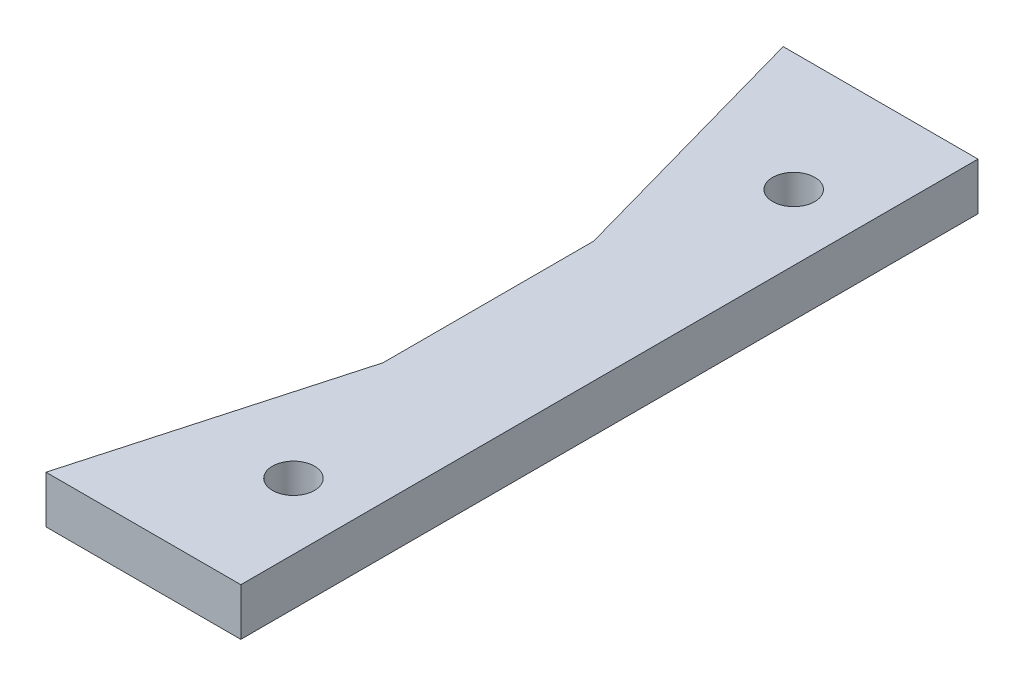
ISO-10303-21;
HEADER;
FILE_DESCRIPTION(('STEP AP214'),'2;1');
FILE_NAME('part.step','',(''),(''),'','','');
FILE_SCHEMA(('AUTOMOTIVE_DESIGN { 1 0 10303 214 1 1 1 1 }'));
ENDSEC;
DATA;
#1=APPLICATION_CONTEXT('core data for automotive mechanical design processes');
#2=APPLICATION_PROTOCOL_DEFINITION('international standard','automotive_design',2000,#1);
#3=PRODUCT_CONTEXT('',#1,'mechanical');
#4=PRODUCT('Part','Part','',(#3));
#5=PRODUCT_RELATED_PRODUCT_CATEGORY('part','',(#4));
#6=PRODUCT_DEFINITION_FORMATION('','',#4);
#7=PRODUCT_DEFINITION_CONTEXT('part definition',#1,'design');
#8=PRODUCT_DEFINITION('design','',#6,#7);
#9=PRODUCT_DEFINITION_SHAPE('','',#8);
#10=(LENGTH_UNIT() NAMED_UNIT(*) SI_UNIT(.MILLI.,.METRE.));
#11=(NAMED_UNIT(*) PLANE_ANGLE_UNIT() SI_UNIT($,.RADIAN.));
#12=(NAMED_UNIT(*) SI_UNIT($,.STERADIAN.) SOLID_ANGLE_UNIT());
#13=UNCERTAINTY_MEASURE_WITH_UNIT(LENGTH_MEASURE(1.E-05),#10,'distance_accuracy_value','');
#14=(GEOMETRIC_REPRESENTATION_CONTEXT(3) GLOBAL_UNCERTAINTY_ASSIGNED_CONTEXT((#13)) GLOBAL_UNIT_ASSIGNED_CONTEXT((#10,
#11,#12)) REPRESENTATION_CONTEXT('',''));
#15=CARTESIAN_POINT('',(0.,0.,0.));
#16=DIRECTION('',(0.,0.,1.));
#17=DIRECTION('',(1.,0.,0.));
#18=AXIS2_PLACEMENT_3D('',#15,#16,#17);
#19=CARTESIAN_POINT('',(0.,9.,0.));
#20=DIRECTION('',(1.,0.,0.));
#21=DIRECTION('',(0.,0.,-1.));
#22=AXIS2_PLACEMENT_3D('',#19,#20,#21);
#23=PLANE('',#22);
#24=DIRECTION('',(0.,0.,1.));
#25=VECTOR('',#24,1.);
#26=CARTESIAN_POINT('',(0.,0.,0.));
#27=LINE('',#26,#25);
#28=CARTESIAN_POINT('',(0.,0.,-70.));
#29=VERTEX_POINT('',#28);
#30=CARTESIAN_POINT('',(0.,0.,70.));
#31=VERTEX_POINT('',#30);
#32=EDGE_CURVE('E129',#29,#31,#27,.T.);
#33=ORIENTED_EDGE('',*,*,#32,.F.);
#34=DIRECTION('',(0.,-1.,0.));
#35=VECTOR('',#34,1.);
#36=CARTESIAN_POINT('',(0.,9.,-70.));
#37=LINE('',#36,#35);
#38=CARTESIAN_POINT('',(0.,9.,-70.));
#39=VERTEX_POINT('',#38);
#40=EDGE_CURVE('E11',#39,#29,#37,.T.);
#41=ORIENTED_EDGE('',*,*,#40,.F.);
#42=DIRECTION('',(0.,0.,1.));
#43=VECTOR('',#42,1.);
#44=CARTESIAN_POINT('',(0.,9.,0.));
#45=LINE('',#44,#43);
#46=CARTESIAN_POINT('',(0.,9.,70.));
#47=VERTEX_POINT('',#46);
#48=EDGE_CURVE('E148',#39,#47,#45,.T.);
#49=ORIENTED_EDGE('',*,*,#48,.T.);
#50=DIRECTION('',(0.,-1.,0.));
#51=VECTOR('',#50,1.);
#52=CARTESIAN_POINT('',(0.,9.,70.));
#53=LINE('',#52,#51);
#54=EDGE_CURVE('E84',#47,#31,#53,.T.);
#55=ORIENTED_EDGE('',*,*,#54,.T.);
#56=EDGE_LOOP('',(#33,#41,#49,#55));
#57=FACE_BOUND('',#56,.T.);
#58=ADVANCED_FACE('F40',(#57),#23,.T.);
#59=CARTESIAN_POINT('',(0.,9.,-70.));
#60=DIRECTION('',(0.,0.,-1.));
#61=DIRECTION('',(-1.,0.,0.));
#62=AXIS2_PLACEMENT_3D('',#59,#60,#61);
#63=PLANE('',#62);
#64=DIRECTION('',(1.,0.,0.));
#65=VECTOR('',#64,1.);
#66=CARTESIAN_POINT('',(0.,0.,-70.));
#67=LINE('',#66,#65);
#68=CARTESIAN_POINT('',(-37.,0.,-70.));
#69=VERTEX_POINT('',#68);
#70=EDGE_CURVE('E132',#69,#29,#67,.T.);
#71=ORIENTED_EDGE('',*,*,#70,.F.);
#72=DIRECTION('',(0.,-1.,0.));
#73=VECTOR('',#72,1.);
#74=CARTESIAN_POINT('',(-37.,9.,-70.));
#75=LINE('',#74,#73);
#76=CARTESIAN_POINT('',(-37.,9.,-70.));
#77=VERTEX_POINT('',#76);
#78=EDGE_CURVE('E48',#77,#69,#75,.T.);
#79=ORIENTED_EDGE('',*,*,#78,.F.);
#80=DIRECTION('',(1.,0.,0.));
#81=VECTOR('',#80,1.);
#82=CARTESIAN_POINT('',(0.,9.,-70.));
#83=LINE('',#82,#81);
#84=EDGE_CURVE('E161',#77,#39,#83,.T.);
#85=ORIENTED_EDGE('',*,*,#84,.T.);
#86=ORIENTED_EDGE('',*,*,#40,.T.);
#87=EDGE_LOOP('',(#71,#79,#85,#86));
#88=FACE_BOUND('',#87,.T.);
#89=ADVANCED_FACE('F160',(#88),#63,.T.);
#90=CARTESIAN_POINT('',(-16.1350148367953,9.,4.51780415430267));
#91=DIRECTION('',(0.962964019714182,0.,-0.26962992551997));
#92=DIRECTION('',(-0.26962992551997,0.,-0.962964019714182));
#93=AXIS2_PLACEMENT_3D('',#90,#91,#92);
#94=PLANE('',#93);
#95=DIRECTION('',(0.26962992551997,0.,0.962964019714182));
#96=VECTOR('',#95,1.);
#97=CARTESIAN_POINT('',(-16.1350148367953,0.,4.51780415430267));
#98=LINE('',#97,#96);
#99=CARTESIAN_POINT('',(-23.,0.,-20.));
#100=VERTEX_POINT('',#99);
#101=EDGE_CURVE('E135',#69,#100,#98,.T.);
#102=ORIENTED_EDGE('',*,*,#101,.T.);
#103=DIRECTION('',(0.,-1.,0.));
#104=VECTOR('',#103,1.);
#105=CARTESIAN_POINT('',(-23.,9.,-20.));
#106=LINE('',#105,#104);
#107=CARTESIAN_POINT('',(-23.,9.,-20.));
#108=VERTEX_POINT('',#107);
#109=EDGE_CURVE('E116',#108,#100,#106,.T.);
#110=ORIENTED_EDGE('',*,*,#109,.F.);
#111=DIRECTION('',(0.26962992551997,0.,0.962964019714182));
#112=VECTOR('',#111,1.);
#113=CARTESIAN_POINT('',(-16.1350148367953,9.,4.51780415430267));
#114=LINE('',#113,#112);
#115=EDGE_CURVE('E103',#77,#108,#114,.T.);
#116=ORIENTED_EDGE('',*,*,#115,.F.);
#117=ORIENTED_EDGE('',*,*,#78,.T.);
#118=EDGE_LOOP('',(#102,#110,#116,#117));
#119=FACE_BOUND('',#118,.T.);
#120=ADVANCED_FACE('F153',(#119),#94,.F.);
#121=CARTESIAN_POINT('',(-23.,9.,0.));
#122=DIRECTION('',(1.,0.,0.));
#123=DIRECTION('',(0.,0.,-1.));
#124=AXIS2_PLACEMENT_3D('',#121,#122,#123);
#125=PLANE('',#124);
#126=DIRECTION('',(0.,0.,1.));
#127=VECTOR('',#126,1.);
#128=CARTESIAN_POINT('',(-23.,0.,0.));
#129=LINE('',#128,#127);
#130=CARTESIAN_POINT('',(-23.,0.,20.));
#131=VERTEX_POINT('',#130);
#132=EDGE_CURVE('E112',#100,#131,#129,.T.);
#133=ORIENTED_EDGE('',*,*,#132,.T.);
#134=DIRECTION('',(0.,-1.,0.));
#135=VECTOR('',#134,1.);
#136=CARTESIAN_POINT('',(-23.,9.,20.));
#137=LINE('',#136,#135);
#138=CARTESIAN_POINT('',(-23.,9.,20.));
#139=VERTEX_POINT('',#138);
#140=EDGE_CURVE('E109',#139,#131,#137,.T.);
#141=ORIENTED_EDGE('',*,*,#140,.F.);
#142=DIRECTION('',(0.,0.,1.));
#143=VECTOR('',#142,1.);
#144=CARTESIAN_POINT('',(-23.,9.,0.));
#145=LINE('',#144,#143);
#146=EDGE_CURVE('E95',#108,#139,#145,.T.);
#147=ORIENTED_EDGE('',*,*,#146,.F.);
#148=ORIENTED_EDGE('',*,*,#109,.T.);
#149=EDGE_LOOP('',(#133,#141,#147,#148));
#150=FACE_BOUND('',#149,.T.);
#151=ADVANCED_FACE('F110',(#150),#125,.F.);
#152=CARTESIAN_POINT('',(-16.1350148367953,9.,-4.51780415430267));
#153=DIRECTION('',(-0.962964019714182,0.,-0.26962992551997));
#154=DIRECTION('',(-0.26962992551997,0.,0.962964019714182));
#155=AXIS2_PLACEMENT_3D('',#152,#153,#154);
#156=PLANE('',#155);
#157=DIRECTION('',(0.26962992551997,0.,-0.962964019714182));
#158=VECTOR('',#157,1.);
#159=CARTESIAN_POINT('',(-16.1350148367953,0.,-4.51780415430267));
#160=LINE('',#159,#158);
#161=CARTESIAN_POINT('',(-37.,0.,70.));
#162=VERTEX_POINT('',#161);
#163=EDGE_CURVE('E138',#162,#131,#160,.T.);
#164=ORIENTED_EDGE('',*,*,#163,.F.);
#165=DIRECTION('',(0.,-1.,0.));
#166=VECTOR('',#165,1.);
#167=CARTESIAN_POINT('',(-37.,9.,70.));
#168=LINE('',#167,#166);
#169=CARTESIAN_POINT('',(-37.,9.,70.));
#170=VERTEX_POINT('',#169);
#171=EDGE_CURVE('E77',#170,#162,#168,.T.);
#172=ORIENTED_EDGE('',*,*,#171,.F.);
#173=DIRECTION('',(0.26962992551997,0.,-0.962964019714182));
#174=VECTOR('',#173,1.);
#175=CARTESIAN_POINT('',(-16.1350148367953,9.,-4.51780415430267));
#176=LINE('',#175,#174);
#177=EDGE_CURVE('E100',#170,#139,#176,.T.);
#178=ORIENTED_EDGE('',*,*,#177,.T.);
#179=ORIENTED_EDGE('',*,*,#140,.T.);
#180=EDGE_LOOP('',(#164,#172,#178,#179));
#181=FACE_BOUND('',#180,.T.);
#182=ADVANCED_FACE('F118',(#181),#156,.T.);
#183=CARTESIAN_POINT('',(-12.5,9.,-47.5));
#184=DIRECTION('',(0.,-1.,0.));
#185=DIRECTION('',(0.,0.,-1.));
#186=AXIS2_PLACEMENT_3D('',#183,#184,#185);
#187=CYLINDRICAL_SURFACE('',#186,4.00000000000001);
#188=CARTESIAN_POINT('',(-12.5,9.,-47.5));
#189=DIRECTION('',(0.,1.,0.));
#190=DIRECTION('',(0.,0.,1.));
#191=AXIS2_PLACEMENT_3D('',#188,#189,#190);
#192=CIRCLE('',#191,4.00000000000001);
#193=CARTESIAN_POINT('',(-12.5,9.,-43.5));
#194=VERTEX_POINT('',#193);
#195=EDGE_CURVE('E120',#194,#194,#192,.T.);
#196=ORIENTED_EDGE('',*,*,#195,.T.);
#197=EDGE_LOOP('',(#196));
#198=FACE_BOUND('',#197,.T.);
#199=CARTESIAN_POINT('',(-12.5,0.,-47.5));
#200=DIRECTION('',(0.,1.,0.));
#201=DIRECTION('',(0.,0.,1.));
#202=AXIS2_PLACEMENT_3D('',#199,#200,#201);
#203=CIRCLE('',#202,4.00000000000001);
#204=CARTESIAN_POINT('',(-12.5,0.,-43.5));
#205=VERTEX_POINT('',#204);
#206=EDGE_CURVE('E142',#205,#205,#203,.T.);
#207=ORIENTED_EDGE('',*,*,#206,.F.);
#208=EDGE_LOOP('',(#207));
#209=FACE_BOUND('',#208,.T.);
#210=ADVANCED_FACE('F167',(#198,#209),#187,.F.);
#211=CARTESIAN_POINT('',(0.,9.,70.));
#212=DIRECTION('',(0.,0.,-1.));
#213=DIRECTION('',(-1.,0.,0.));
#214=AXIS2_PLACEMENT_3D('',#211,#212,#213);
#215=PLANE('',#214);
#216=DIRECTION('',(1.,0.,0.));
#217=VECTOR('',#216,1.);
#218=CARTESIAN_POINT('',(0.,0.,70.));
#219=LINE('',#218,#217);
#220=EDGE_CURVE('E140',#162,#31,#219,.T.);
#221=ORIENTED_EDGE('',*,*,#220,.T.);
#222=ORIENTED_EDGE('',*,*,#54,.F.);
#223=DIRECTION('',(1.,0.,0.));
#224=VECTOR('',#223,1.);
#225=CARTESIAN_POINT('',(0.,9.,70.));
#226=LINE('',#225,#224);
#227=EDGE_CURVE('E56',#170,#47,#226,.T.);
#228=ORIENTED_EDGE('',*,*,#227,.F.);
#229=ORIENTED_EDGE('',*,*,#171,.T.);
#230=EDGE_LOOP('',(#221,#222,#228,#229));
#231=FACE_BOUND('',#230,.T.);
#232=ADVANCED_FACE('F162',(#231),#215,.F.);
#233=CARTESIAN_POINT('',(-12.5,9.,47.5));
#234=DIRECTION('',(0.,-1.,0.));
#235=DIRECTION('',(0.,0.,-1.));
#236=AXIS2_PLACEMENT_3D('',#233,#234,#235);
#237=CYLINDRICAL_SURFACE('',#236,4.00000000000001);
#238=CARTESIAN_POINT('',(-12.5,9.,47.5));
#239=DIRECTION('',(0.,1.,0.));
#240=DIRECTION('',(0.,0.,1.));
#241=AXIS2_PLACEMENT_3D('',#238,#239,#240);
#242=CIRCLE('',#241,4.00000000000001);
#243=CARTESIAN_POINT('',(-12.5,9.,51.5));
#244=VERTEX_POINT('',#243);
#245=EDGE_CURVE('E126',#244,#244,#242,.F.);
#246=ORIENTED_EDGE('',*,*,#245,.F.);
#247=EDGE_LOOP('',(#246));
#248=FACE_BOUND('',#247,.T.);
#249=CARTESIAN_POINT('',(-12.5,0.,47.5));
#250=DIRECTION('',(0.,1.,0.));
#251=DIRECTION('',(0.,0.,1.));
#252=AXIS2_PLACEMENT_3D('',#249,#250,#251);
#253=CIRCLE('',#252,4.00000000000001);
#254=CARTESIAN_POINT('',(-12.5,0.,51.5));
#255=VERTEX_POINT('',#254);
#256=EDGE_CURVE('E145',#255,#255,#253,.F.);
#257=ORIENTED_EDGE('',*,*,#256,.T.);
#258=EDGE_LOOP('',(#257));
#259=FACE_BOUND('',#258,.T.);
#260=ADVANCED_FACE('F166',(#248,#259),#237,.F.);
#261=CARTESIAN_POINT('',(0.,9.,0.));
#262=DIRECTION('',(0.,1.,0.));
#263=DIRECTION('',(0.,0.,1.));
#264=AXIS2_PLACEMENT_3D('',#261,#262,#263);
#265=PLANE('',#264);
#266=ORIENTED_EDGE('',*,*,#48,.F.);
#267=ORIENTED_EDGE('',*,*,#84,.F.);
#268=ORIENTED_EDGE('',*,*,#115,.T.);
#269=ORIENTED_EDGE('',*,*,#146,.T.);
#270=ORIENTED_EDGE('',*,*,#177,.F.);
#271=ORIENTED_EDGE('',*,*,#227,.T.);
#272=EDGE_LOOP('',(#266,#267,#268,#269,#270,#271));
#273=FACE_BOUND('',#272,.T.);
#274=ORIENTED_EDGE('',*,*,#195,.F.);
#275=EDGE_LOOP('',(#274));
#276=FACE_BOUND('',#275,.T.);
#277=ORIENTED_EDGE('',*,*,#245,.T.);
#278=EDGE_LOOP('',(#277));
#279=FACE_BOUND('',#278,.T.);
#280=ADVANCED_FACE('F97',(#273,#276,#279),#265,.T.);
#281=CARTESIAN_POINT('',(0.,0.,0.));
#282=DIRECTION('',(0.,1.,0.));
#283=DIRECTION('',(0.,0.,1.));
#284=AXIS2_PLACEMENT_3D('',#281,#282,#283);
#285=PLANE('',#284);
#286=ORIENTED_EDGE('',*,*,#32,.T.);
#287=ORIENTED_EDGE('',*,*,#220,.F.);
#288=ORIENTED_EDGE('',*,*,#163,.T.);
#289=ORIENTED_EDGE('',*,*,#132,.F.);
#290=ORIENTED_EDGE('',*,*,#101,.F.);
#291=ORIENTED_EDGE('',*,*,#70,.T.);
#292=EDGE_LOOP('',(#286,#287,#288,#289,#290,#291));
#293=FACE_BOUND('',#292,.T.);
#294=ORIENTED_EDGE('',*,*,#206,.T.);
#295=EDGE_LOOP('',(#294));
#296=FACE_BOUND('',#295,.T.);
#297=ORIENTED_EDGE('',*,*,#256,.F.);
#298=EDGE_LOOP('',(#297));
#299=FACE_BOUND('',#298,.T.);
#300=ADVANCED_FACE('F158',(#293,#296,#299),#285,.F.);
#301=CLOSED_SHELL('',(#58,#89,#120,#151,#182,#210,#232,#260,#280,#300));
#302=MANIFOLD_SOLID_BREP('B2',#301);
#303=ADVANCED_BREP_SHAPE_REPRESENTATION('',(#18,#302),#14);
#304=SHAPE_DEFINITION_REPRESENTATION(#9,#303);
ENDSEC;
END-ISO-10303-21;
